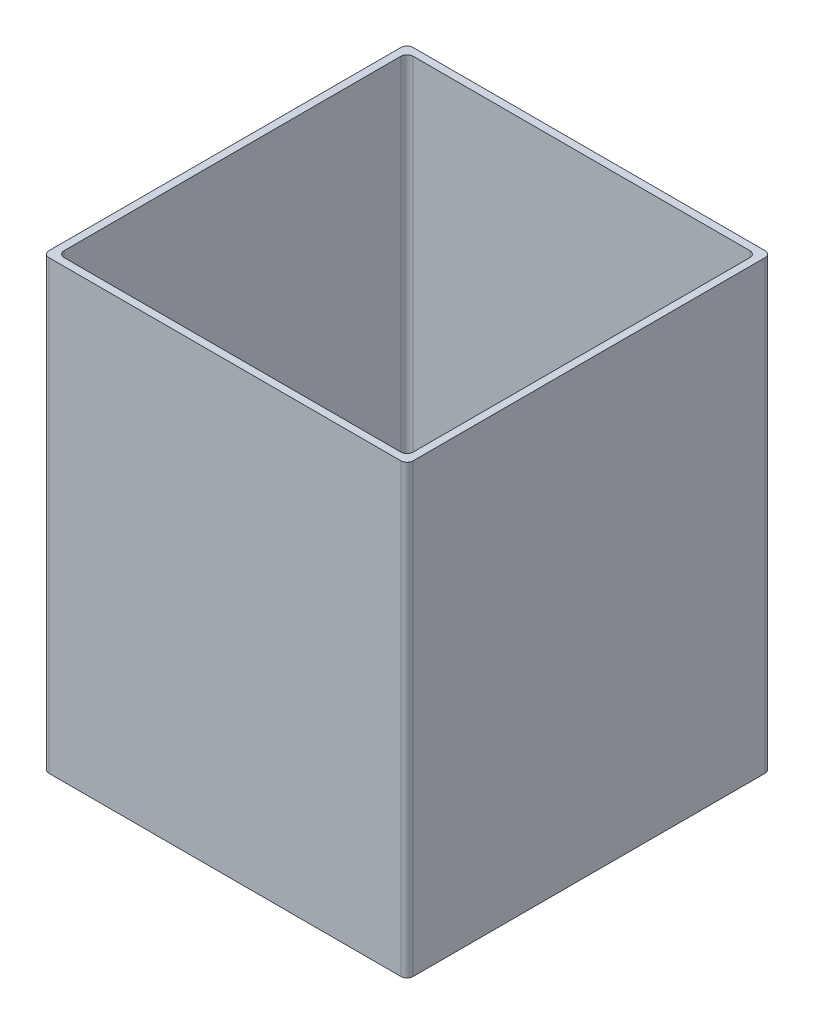
ISO-10303-21;
HEADER;
FILE_DESCRIPTION(('STEP AP214'),'2;1');
FILE_NAME('part.step','',(''),(''),'','','');
FILE_SCHEMA(('AUTOMOTIVE_DESIGN { 1 0 10303 214 1 1 1 1 }'));
ENDSEC;
DATA;
#1=APPLICATION_CONTEXT('core data for automotive mechanical design processes');
#2=APPLICATION_PROTOCOL_DEFINITION('international standard','automotive_design',2000,#1);
#3=PRODUCT_CONTEXT('',#1,'mechanical');
#4=PRODUCT('Part','Part','',(#3));
#5=PRODUCT_RELATED_PRODUCT_CATEGORY('part','',(#4));
#6=PRODUCT_DEFINITION_FORMATION('','',#4);
#7=PRODUCT_DEFINITION_CONTEXT('part definition',#1,'design');
#8=PRODUCT_DEFINITION('design','',#6,#7);
#9=PRODUCT_DEFINITION_SHAPE('','',#8);
#10=(LENGTH_UNIT() NAMED_UNIT(*) SI_UNIT(.MILLI.,.METRE.));
#11=(NAMED_UNIT(*) PLANE_ANGLE_UNIT() SI_UNIT($,.RADIAN.));
#12=(NAMED_UNIT(*) SI_UNIT($,.STERADIAN.) SOLID_ANGLE_UNIT());
#13=UNCERTAINTY_MEASURE_WITH_UNIT(LENGTH_MEASURE(1.E-05),#10,'distance_accuracy_value','');
#14=(GEOMETRIC_REPRESENTATION_CONTEXT(3) GLOBAL_UNCERTAINTY_ASSIGNED_CONTEXT((#13)) GLOBAL_UNIT_ASSIGNED_CONTEXT((#10,
#11,#12)) REPRESENTATION_CONTEXT('',''));
#15=CARTESIAN_POINT('',(0.,0.,0.));
#16=DIRECTION('',(0.,0.,1.));
#17=DIRECTION('',(1.,0.,0.));
#18=AXIS2_PLACEMENT_3D('',#15,#16,#17);
#19=CARTESIAN_POINT('',(60.,147.2,-60.));
#20=DIRECTION('',(-1.,0.,0.));
#21=DIRECTION('',(0.,0.,1.));
#22=AXIS2_PLACEMENT_3D('',#19,#20,#21);
#23=PLANE('',#22);
#24=DIRECTION('',(0.,0.,-1.));
#25=VECTOR('',#24,1.);
#26=CARTESIAN_POINT('',(60.,147.2,-60.));
#27=LINE('',#26,#25);
#28=CARTESIAN_POINT('',(60.,147.2,58.));
#29=VERTEX_POINT('',#28);
#30=CARTESIAN_POINT('',(60.,147.2,-58.));
#31=VERTEX_POINT('',#30);
#32=EDGE_CURVE('E169',#29,#31,#27,.T.);
#33=ORIENTED_EDGE('',*,*,#32,.F.);
#34=DIRECTION('',(0.,-1.,0.));
#35=VECTOR('',#34,1.);
#36=CARTESIAN_POINT('',(60.,147.2,58.));
#37=LINE('',#36,#35);
#38=CARTESIAN_POINT('',(60.,0.,58.));
#39=VERTEX_POINT('',#38);
#40=EDGE_CURVE('E154',#29,#39,#37,.T.);
#41=ORIENTED_EDGE('',*,*,#40,.T.);
#42=DIRECTION('',(0.,0.,-1.));
#43=VECTOR('',#42,1.);
#44=CARTESIAN_POINT('',(60.,0.,-60.));
#45=LINE('',#44,#43);
#46=CARTESIAN_POINT('',(60.,0.,-58.));
#47=VERTEX_POINT('',#46);
#48=EDGE_CURVE('E166',#39,#47,#45,.T.);
#49=ORIENTED_EDGE('',*,*,#48,.T.);
#50=DIRECTION('',(0.,-1.,0.));
#51=VECTOR('',#50,1.);
#52=CARTESIAN_POINT('',(60.,147.2,-58.));
#53=LINE('',#52,#51);
#54=EDGE_CURVE('E171',#47,#31,#53,.F.);
#55=ORIENTED_EDGE('',*,*,#54,.T.);
#56=EDGE_LOOP('',(#33,#41,#49,#55));
#57=FACE_BOUND('',#56,.T.);
#58=ADVANCED_FACE('F37',(#57),#23,.F.);
#59=CARTESIAN_POINT('',(-60.,147.2,-60.));
#60=DIRECTION('',(0.,0.,1.));
#61=DIRECTION('',(1.,0.,0.));
#62=AXIS2_PLACEMENT_3D('',#59,#60,#61);
#63=PLANE('',#62);
#64=DIRECTION('',(-1.,0.,0.));
#65=VECTOR('',#64,1.);
#66=CARTESIAN_POINT('',(-60.,147.2,-60.));
#67=LINE('',#66,#65);
#68=CARTESIAN_POINT('',(58.,147.2,-60.));
#69=VERTEX_POINT('',#68);
#70=CARTESIAN_POINT('',(-58.,147.2,-60.));
#71=VERTEX_POINT('',#70);
#72=EDGE_CURVE('E281',#69,#71,#67,.T.);
#73=ORIENTED_EDGE('',*,*,#72,.F.);
#74=DIRECTION('',(0.,-1.,0.));
#75=VECTOR('',#74,1.);
#76=CARTESIAN_POINT('',(58.,147.2,-60.));
#77=LINE('',#76,#75);
#78=CARTESIAN_POINT('',(58.,0.,-60.));
#79=VERTEX_POINT('',#78);
#80=EDGE_CURVE('E210',#69,#79,#77,.T.);
#81=ORIENTED_EDGE('',*,*,#80,.T.);
#82=DIRECTION('',(-1.,0.,0.));
#83=VECTOR('',#82,1.);
#84=CARTESIAN_POINT('',(-60.,0.,-60.));
#85=LINE('',#84,#83);
#86=CARTESIAN_POINT('',(-58.,0.,-60.));
#87=VERTEX_POINT('',#86);
#88=EDGE_CURVE('E175',#79,#87,#85,.T.);
#89=ORIENTED_EDGE('',*,*,#88,.T.);
#90=DIRECTION('',(0.,-1.,0.));
#91=VECTOR('',#90,1.);
#92=CARTESIAN_POINT('',(-58.,147.2,-60.));
#93=LINE('',#92,#91);
#94=EDGE_CURVE('E208',#87,#71,#93,.F.);
#95=ORIENTED_EDGE('',*,*,#94,.T.);
#96=EDGE_LOOP('',(#73,#81,#89,#95));
#97=FACE_BOUND('',#96,.T.);
#98=ADVANCED_FACE('F305',(#97),#63,.F.);
#99=CARTESIAN_POINT('',(-60.,147.2,-60.));
#100=DIRECTION('',(1.,0.,0.));
#101=DIRECTION('',(0.,0.,-1.));
#102=AXIS2_PLACEMENT_3D('',#99,#100,#101);
#103=PLANE('',#102);
#104=DIRECTION('',(0.,0.,1.));
#105=VECTOR('',#104,1.);
#106=CARTESIAN_POINT('',(-60.,0.,-60.));
#107=LINE('',#106,#105);
#108=CARTESIAN_POINT('',(-60.,0.,-58.));
#109=VERTEX_POINT('',#108);
#110=CARTESIAN_POINT('',(-60.,0.,58.));
#111=VERTEX_POINT('',#110);
#112=EDGE_CURVE('E179',#109,#111,#107,.T.);
#113=ORIENTED_EDGE('',*,*,#112,.T.);
#114=DIRECTION('',(0.,-1.,0.));
#115=VECTOR('',#114,1.);
#116=CARTESIAN_POINT('',(-60.,147.2,58.));
#117=LINE('',#116,#115);
#118=CARTESIAN_POINT('',(-60.,147.2,58.));
#119=VERTEX_POINT('',#118);
#120=EDGE_CURVE('E216',#111,#119,#117,.F.);
#121=ORIENTED_EDGE('',*,*,#120,.T.);
#122=DIRECTION('',(0.,0.,1.));
#123=VECTOR('',#122,1.);
#124=CARTESIAN_POINT('',(-60.,147.2,-60.));
#125=LINE('',#124,#123);
#126=CARTESIAN_POINT('',(-60.,147.2,-58.));
#127=VERTEX_POINT('',#126);
#128=EDGE_CURVE('E283',#127,#119,#125,.T.);
#129=ORIENTED_EDGE('',*,*,#128,.F.);
#130=DIRECTION('',(0.,-1.,0.));
#131=VECTOR('',#130,1.);
#132=CARTESIAN_POINT('',(-60.,147.2,-58.));
#133=LINE('',#132,#131);
#134=EDGE_CURVE('E213',#127,#109,#133,.T.);
#135=ORIENTED_EDGE('',*,*,#134,.T.);
#136=EDGE_LOOP('',(#113,#121,#129,#135));
#137=FACE_BOUND('',#136,.T.);
#138=ADVANCED_FACE('F297',(#137),#103,.F.);
#139=CARTESIAN_POINT('',(-60.,147.2,60.));
#140=DIRECTION('',(0.,0.,-1.));
#141=DIRECTION('',(-1.,0.,0.));
#142=AXIS2_PLACEMENT_3D('',#139,#140,#141);
#143=PLANE('',#142);
#144=DIRECTION('',(1.,0.,0.));
#145=VECTOR('',#144,1.);
#146=CARTESIAN_POINT('',(-60.,0.,60.));
#147=LINE('',#146,#145);
#148=CARTESIAN_POINT('',(-58.,0.,60.));
#149=VERTEX_POINT('',#148);
#150=CARTESIAN_POINT('',(58.,0.,60.));
#151=VERTEX_POINT('',#150);
#152=EDGE_CURVE('E190',#149,#151,#147,.T.);
#153=ORIENTED_EDGE('',*,*,#152,.T.);
#154=DIRECTION('',(0.,-1.,0.));
#155=VECTOR('',#154,1.);
#156=CARTESIAN_POINT('',(58.,147.2,60.));
#157=LINE('',#156,#155);
#158=CARTESIAN_POINT('',(58.,147.2,60.));
#159=VERTEX_POINT('',#158);
#160=EDGE_CURVE('E155',#151,#159,#157,.F.);
#161=ORIENTED_EDGE('',*,*,#160,.T.);
#162=DIRECTION('',(1.,0.,0.));
#163=VECTOR('',#162,1.);
#164=CARTESIAN_POINT('',(-60.,147.2,60.));
#165=LINE('',#164,#163);
#166=CARTESIAN_POINT('',(-58.,147.2,60.));
#167=VERTEX_POINT('',#166);
#168=EDGE_CURVE('E185',#167,#159,#165,.T.);
#169=ORIENTED_EDGE('',*,*,#168,.F.);
#170=DIRECTION('',(0.,-1.,0.));
#171=VECTOR('',#170,1.);
#172=CARTESIAN_POINT('',(-58.,147.2,60.));
#173=LINE('',#172,#171);
#174=EDGE_CURVE('E160',#167,#149,#173,.T.);
#175=ORIENTED_EDGE('',*,*,#174,.T.);
#176=EDGE_LOOP('',(#153,#161,#169,#175));
#177=FACE_BOUND('',#176,.T.);
#178=ADVANCED_FACE('F291',(#177),#143,.F.);
#179=CARTESIAN_POINT('',(0.,147.2,0.));
#180=DIRECTION('',(0.,1.,0.));
#181=DIRECTION('',(0.,0.,1.));
#182=AXIS2_PLACEMENT_3D('',#179,#180,#181);
#183=PLANE('',#182);
#184=DIRECTION('',(0.,0.,-1.));
#185=VECTOR('',#184,1.);
#186=CARTESIAN_POINT('',(57.5,147.2,0.));
#187=LINE('',#186,#185);
#188=CARTESIAN_POINT('',(57.5,147.2,55.5));
#189=VERTEX_POINT('',#188);
#190=CARTESIAN_POINT('',(57.5,147.2,-55.5));
#191=VERTEX_POINT('',#190);
#192=EDGE_CURVE('E176',#189,#191,#187,.T.);
#193=ORIENTED_EDGE('',*,*,#192,.F.);
#194=CARTESIAN_POINT('',(55.5,147.2,55.5));
#195=DIRECTION('',(0.,1.,0.));
#196=DIRECTION('',(0.,0.,1.));
#197=AXIS2_PLACEMENT_3D('',#194,#195,#196);
#198=CIRCLE('',#197,2.);
#199=CARTESIAN_POINT('',(55.5,147.2,57.5));
#200=VERTEX_POINT('',#199);
#201=EDGE_CURVE('E241',#189,#200,#198,.F.);
#202=ORIENTED_EDGE('',*,*,#201,.T.);
#203=DIRECTION('',(1.,0.,0.));
#204=VECTOR('',#203,1.);
#205=CARTESIAN_POINT('',(0.,147.2,57.5));
#206=LINE('',#205,#204);
#207=CARTESIAN_POINT('',(-55.5,147.2,57.5));
#208=VERTEX_POINT('',#207);
#209=EDGE_CURVE('E182',#208,#200,#206,.T.);
#210=ORIENTED_EDGE('',*,*,#209,.F.);
#211=CARTESIAN_POINT('',(-55.5,147.2,55.5));
#212=DIRECTION('',(0.,1.,0.));
#213=DIRECTION('',(0.,0.,1.));
#214=AXIS2_PLACEMENT_3D('',#211,#212,#213);
#215=CIRCLE('',#214,2.);
#216=CARTESIAN_POINT('',(-57.5,147.2,55.5));
#217=VERTEX_POINT('',#216);
#218=EDGE_CURVE('E245',#208,#217,#215,.F.);
#219=ORIENTED_EDGE('',*,*,#218,.T.);
#220=DIRECTION('',(0.,0.,1.));
#221=VECTOR('',#220,1.);
#222=CARTESIAN_POINT('',(-57.5,147.2,0.));
#223=LINE('',#222,#221);
#224=CARTESIAN_POINT('',(-57.5,147.2,-55.5));
#225=VERTEX_POINT('',#224);
#226=EDGE_CURVE('E256',#225,#217,#223,.T.);
#227=ORIENTED_EDGE('',*,*,#226,.F.);
#228=CARTESIAN_POINT('',(-55.5,147.2,-55.5));
#229=DIRECTION('',(0.,1.,0.));
#230=DIRECTION('',(0.,0.,1.));
#231=AXIS2_PLACEMENT_3D('',#228,#229,#230);
#232=CIRCLE('',#231,2.);
#233=CARTESIAN_POINT('',(-55.5,147.2,-57.5));
#234=VERTEX_POINT('',#233);
#235=EDGE_CURVE('E45',#225,#234,#232,.F.);
#236=ORIENTED_EDGE('',*,*,#235,.T.);
#237=DIRECTION('',(-1.,0.,0.));
#238=VECTOR('',#237,1.);
#239=CARTESIAN_POINT('',(0.,147.2,-57.5));
#240=LINE('',#239,#238);
#241=CARTESIAN_POINT('',(55.5,147.2,-57.5));
#242=VERTEX_POINT('',#241);
#243=EDGE_CURVE('E255',#242,#234,#240,.T.);
#244=ORIENTED_EDGE('',*,*,#243,.F.);
#245=CARTESIAN_POINT('',(55.5,147.2,-55.5));
#246=DIRECTION('',(0.,1.,0.));
#247=DIRECTION('',(0.,0.,1.));
#248=AXIS2_PLACEMENT_3D('',#245,#246,#247);
#249=CIRCLE('',#248,2.);
#250=EDGE_CURVE('E237',#242,#191,#249,.F.);
#251=ORIENTED_EDGE('',*,*,#250,.T.);
#252=EDGE_LOOP('',(#193,#202,#210,#219,#227,#236,#244,#251));
#253=FACE_BOUND('',#252,.T.);
#254=ORIENTED_EDGE('',*,*,#168,.T.);
#255=CARTESIAN_POINT('',(58.,147.2,58.));
#256=DIRECTION('',(0.,1.,0.));
#257=DIRECTION('',(0.,0.,1.));
#258=AXIS2_PLACEMENT_3D('',#255,#256,#257);
#259=CIRCLE('',#258,2.);
#260=EDGE_CURVE('E206',#159,#29,#259,.T.);
#261=ORIENTED_EDGE('',*,*,#260,.T.);
#262=ORIENTED_EDGE('',*,*,#32,.T.);
#263=CARTESIAN_POINT('',(58.,147.2,-58.));
#264=DIRECTION('',(0.,1.,0.));
#265=DIRECTION('',(0.,0.,1.));
#266=AXIS2_PLACEMENT_3D('',#263,#264,#265);
#267=CIRCLE('',#266,2.);
#268=EDGE_CURVE('E204',#31,#69,#267,.T.);
#269=ORIENTED_EDGE('',*,*,#268,.T.);
#270=ORIENTED_EDGE('',*,*,#72,.T.);
#271=CARTESIAN_POINT('',(-58.,147.2,-58.));
#272=DIRECTION('',(0.,1.,0.));
#273=DIRECTION('',(0.,0.,1.));
#274=AXIS2_PLACEMENT_3D('',#271,#272,#273);
#275=CIRCLE('',#274,2.);
#276=EDGE_CURVE('E200',#71,#127,#275,.T.);
#277=ORIENTED_EDGE('',*,*,#276,.T.);
#278=ORIENTED_EDGE('',*,*,#128,.T.);
#279=CARTESIAN_POINT('',(-58.,147.2,58.));
#280=DIRECTION('',(0.,1.,0.));
#281=DIRECTION('',(0.,0.,1.));
#282=AXIS2_PLACEMENT_3D('',#279,#280,#281);
#283=CIRCLE('',#282,2.);
#284=EDGE_CURVE('E202',#119,#167,#283,.T.);
#285=ORIENTED_EDGE('',*,*,#284,.T.);
#286=EDGE_LOOP('',(#254,#261,#262,#269,#270,#277,#278,#285));
#287=FACE_BOUND('',#286,.T.);
#288=ADVANCED_FACE('F253',(#253,#287),#183,.T.);
#289=CARTESIAN_POINT('',(0.,0.,0.));
#290=DIRECTION('',(0.,1.,0.));
#291=DIRECTION('',(0.,0.,1.));
#292=AXIS2_PLACEMENT_3D('',#289,#290,#291);
#293=PLANE('',#292);
#294=DIRECTION('',(0.,0.,1.));
#295=VECTOR('',#294,1.);
#296=CARTESIAN_POINT('',(-57.5,0.,-57.5));
#297=LINE('',#296,#295);
#298=CARTESIAN_POINT('',(-57.5,0.,-55.5));
#299=VERTEX_POINT('',#298);
#300=CARTESIAN_POINT('',(-57.5,0.,55.5));
#301=VERTEX_POINT('',#300);
#302=EDGE_CURVE('E267',#299,#301,#297,.T.);
#303=ORIENTED_EDGE('',*,*,#302,.T.);
#304=CARTESIAN_POINT('',(-55.5,0.,55.5));
#305=DIRECTION('',(0.,1.,0.));
#306=DIRECTION('',(0.,0.,1.));
#307=AXIS2_PLACEMENT_3D('',#304,#305,#306);
#308=CIRCLE('',#307,2.);
#309=CARTESIAN_POINT('',(-55.5,0.,57.5));
#310=VERTEX_POINT('',#309);
#311=EDGE_CURVE('E247',#301,#310,#308,.T.);
#312=ORIENTED_EDGE('',*,*,#311,.T.);
#313=DIRECTION('',(1.,0.,0.));
#314=VECTOR('',#313,1.);
#315=CARTESIAN_POINT('',(-57.5,0.,57.5));
#316=LINE('',#315,#314);
#317=CARTESIAN_POINT('',(55.5,0.,57.5));
#318=VERTEX_POINT('',#317);
#319=EDGE_CURVE('E264',#310,#318,#316,.T.);
#320=ORIENTED_EDGE('',*,*,#319,.T.);
#321=CARTESIAN_POINT('',(55.5,0.,55.5));
#322=DIRECTION('',(0.,1.,0.));
#323=DIRECTION('',(0.,0.,1.));
#324=AXIS2_PLACEMENT_3D('',#321,#322,#323);
#325=CIRCLE('',#324,2.);
#326=CARTESIAN_POINT('',(57.5,0.,55.5));
#327=VERTEX_POINT('',#326);
#328=EDGE_CURVE('E243',#318,#327,#325,.T.);
#329=ORIENTED_EDGE('',*,*,#328,.T.);
#330=DIRECTION('',(0.,0.,-1.));
#331=VECTOR('',#330,1.);
#332=CARTESIAN_POINT('',(57.5,0.,-57.5));
#333=LINE('',#332,#331);
#334=CARTESIAN_POINT('',(57.5,0.,-55.5));
#335=VERTEX_POINT('',#334);
#336=EDGE_CURVE('E273',#327,#335,#333,.T.);
#337=ORIENTED_EDGE('',*,*,#336,.T.);
#338=CARTESIAN_POINT('',(55.5,0.,-55.5));
#339=DIRECTION('',(0.,1.,0.));
#340=DIRECTION('',(0.,0.,1.));
#341=AXIS2_PLACEMENT_3D('',#338,#339,#340);
#342=CIRCLE('',#341,2.);
#343=CARTESIAN_POINT('',(55.5,0.,-57.5));
#344=VERTEX_POINT('',#343);
#345=EDGE_CURVE('E239',#335,#344,#342,.T.);
#346=ORIENTED_EDGE('',*,*,#345,.T.);
#347=DIRECTION('',(-1.,0.,0.));
#348=VECTOR('',#347,1.);
#349=CARTESIAN_POINT('',(-57.5,0.,-57.5));
#350=LINE('',#349,#348);
#351=CARTESIAN_POINT('',(-55.5,0.,-57.5));
#352=VERTEX_POINT('',#351);
#353=EDGE_CURVE('E269',#344,#352,#350,.T.);
#354=ORIENTED_EDGE('',*,*,#353,.T.);
#355=CARTESIAN_POINT('',(-55.5,0.,-55.5));
#356=DIRECTION('',(0.,1.,0.));
#357=DIRECTION('',(0.,0.,1.));
#358=AXIS2_PLACEMENT_3D('',#355,#356,#357);
#359=CIRCLE('',#358,2.);
#360=EDGE_CURVE('E11',#352,#299,#359,.T.);
#361=ORIENTED_EDGE('',*,*,#360,.T.);
#362=EDGE_LOOP('',(#303,#312,#320,#329,#337,#346,#354,#361));
#363=FACE_BOUND('',#362,.T.);
#364=ORIENTED_EDGE('',*,*,#48,.F.);
#365=CARTESIAN_POINT('',(58.,0.,58.));
#366=DIRECTION('',(0.,1.,0.));
#367=DIRECTION('',(0.,0.,1.));
#368=AXIS2_PLACEMENT_3D('',#365,#366,#367);
#369=CIRCLE('',#368,2.);
#370=EDGE_CURVE('E150',#39,#151,#369,.F.);
#371=ORIENTED_EDGE('',*,*,#370,.T.);
#372=ORIENTED_EDGE('',*,*,#152,.F.);
#373=CARTESIAN_POINT('',(-58.,0.,58.));
#374=DIRECTION('',(0.,1.,0.));
#375=DIRECTION('',(0.,0.,1.));
#376=AXIS2_PLACEMENT_3D('',#373,#374,#375);
#377=CIRCLE('',#376,2.);
#378=EDGE_CURVE('E194',#149,#111,#377,.F.);
#379=ORIENTED_EDGE('',*,*,#378,.T.);
#380=ORIENTED_EDGE('',*,*,#112,.F.);
#381=CARTESIAN_POINT('',(-58.,0.,-58.));
#382=DIRECTION('',(0.,1.,0.));
#383=DIRECTION('',(0.,0.,1.));
#384=AXIS2_PLACEMENT_3D('',#381,#382,#383);
#385=CIRCLE('',#384,2.);
#386=EDGE_CURVE('E170',#109,#87,#385,.F.);
#387=ORIENTED_EDGE('',*,*,#386,.T.);
#388=ORIENTED_EDGE('',*,*,#88,.F.);
#389=CARTESIAN_POINT('',(58.,0.,-58.));
#390=DIRECTION('',(0.,1.,0.));
#391=DIRECTION('',(0.,0.,1.));
#392=AXIS2_PLACEMENT_3D('',#389,#390,#391);
#393=CIRCLE('',#392,2.);
#394=EDGE_CURVE('E161',#79,#47,#393,.F.);
#395=ORIENTED_EDGE('',*,*,#394,.T.);
#396=EDGE_LOOP('',(#364,#371,#372,#379,#380,#387,#388,#395));
#397=FACE_BOUND('',#396,.T.);
#398=ADVANCED_FACE('F173',(#363,#397),#293,.F.);
#399=CARTESIAN_POINT('',(57.5,0.,-57.5));
#400=DIRECTION('',(1.,0.,0.));
#401=DIRECTION('',(0.,0.,-1.));
#402=AXIS2_PLACEMENT_3D('',#399,#400,#401);
#403=PLANE('',#402);
#404=ORIENTED_EDGE('',*,*,#192,.T.);
#405=DIRECTION('',(0.,1.,0.));
#406=VECTOR('',#405,1.);
#407=CARTESIAN_POINT('',(57.5,0.,-55.5));
#408=LINE('',#407,#406);
#409=EDGE_CURVE('E226',#191,#335,#408,.F.);
#410=ORIENTED_EDGE('',*,*,#409,.T.);
#411=ORIENTED_EDGE('',*,*,#336,.F.);
#412=DIRECTION('',(0.,1.,0.));
#413=VECTOR('',#412,1.);
#414=CARTESIAN_POINT('',(57.5,147.2,55.5));
#415=LINE('',#414,#413);
#416=EDGE_CURVE('E223',#327,#189,#415,.T.);
#417=ORIENTED_EDGE('',*,*,#416,.T.);
#418=EDGE_LOOP('',(#404,#410,#411,#417));
#419=FACE_BOUND('',#418,.T.);
#420=ADVANCED_FACE('F331',(#419),#403,.F.);
#421=CARTESIAN_POINT('',(-57.5,0.,57.5));
#422=DIRECTION('',(0.,0.,1.));
#423=DIRECTION('',(1.,0.,0.));
#424=AXIS2_PLACEMENT_3D('',#421,#422,#423);
#425=PLANE('',#424);
#426=ORIENTED_EDGE('',*,*,#209,.T.);
#427=DIRECTION('',(0.,1.,0.));
#428=VECTOR('',#427,1.);
#429=CARTESIAN_POINT('',(55.5,0.,57.5));
#430=LINE('',#429,#428);
#431=EDGE_CURVE('E231',#200,#318,#430,.F.);
#432=ORIENTED_EDGE('',*,*,#431,.T.);
#433=ORIENTED_EDGE('',*,*,#319,.F.);
#434=DIRECTION('',(0.,1.,0.));
#435=VECTOR('',#434,1.);
#436=CARTESIAN_POINT('',(-55.5,147.2,57.5));
#437=LINE('',#436,#435);
#438=EDGE_CURVE('E228',#310,#208,#437,.T.);
#439=ORIENTED_EDGE('',*,*,#438,.T.);
#440=EDGE_LOOP('',(#426,#432,#433,#439));
#441=FACE_BOUND('',#440,.T.);
#442=ADVANCED_FACE('F336',(#441),#425,.F.);
#443=CARTESIAN_POINT('',(-57.5,0.,-57.5));
#444=DIRECTION('',(-1.,0.,0.));
#445=DIRECTION('',(0.,0.,1.));
#446=AXIS2_PLACEMENT_3D('',#443,#444,#445);
#447=PLANE('',#446);
#448=ORIENTED_EDGE('',*,*,#226,.T.);
#449=DIRECTION('',(0.,1.,0.));
#450=VECTOR('',#449,1.);
#451=CARTESIAN_POINT('',(-57.5,0.,55.5));
#452=LINE('',#451,#450);
#453=EDGE_CURVE('E52',#217,#301,#452,.F.);
#454=ORIENTED_EDGE('',*,*,#453,.T.);
#455=ORIENTED_EDGE('',*,*,#302,.F.);
#456=DIRECTION('',(0.,1.,0.));
#457=VECTOR('',#456,1.);
#458=CARTESIAN_POINT('',(-57.5,147.2,-55.5));
#459=LINE('',#458,#457);
#460=EDGE_CURVE('E233',#299,#225,#459,.T.);
#461=ORIENTED_EDGE('',*,*,#460,.T.);
#462=EDGE_LOOP('',(#448,#454,#455,#461));
#463=FACE_BOUND('',#462,.T.);
#464=ADVANCED_FACE('F266',(#463),#447,.F.);
#465=CARTESIAN_POINT('',(-57.5,0.,-57.5));
#466=DIRECTION('',(0.,0.,-1.));
#467=DIRECTION('',(-1.,0.,0.));
#468=AXIS2_PLACEMENT_3D('',#465,#466,#467);
#469=PLANE('',#468);
#470=ORIENTED_EDGE('',*,*,#353,.F.);
#471=DIRECTION('',(0.,1.,0.));
#472=VECTOR('',#471,1.);
#473=CARTESIAN_POINT('',(55.5,147.2,-57.5));
#474=LINE('',#473,#472);
#475=EDGE_CURVE('E220',#344,#242,#474,.T.);
#476=ORIENTED_EDGE('',*,*,#475,.T.);
#477=ORIENTED_EDGE('',*,*,#243,.T.);
#478=DIRECTION('',(0.,1.,0.));
#479=VECTOR('',#478,1.);
#480=CARTESIAN_POINT('',(-55.5,0.,-57.5));
#481=LINE('',#480,#479);
#482=EDGE_CURVE('E218',#234,#352,#481,.F.);
#483=ORIENTED_EDGE('',*,*,#482,.T.);
#484=EDGE_LOOP('',(#470,#476,#477,#483));
#485=FACE_BOUND('',#484,.T.);
#486=ADVANCED_FACE('F262',(#485),#469,.F.);
#487=CARTESIAN_POINT('',(58.,147.2,58.));
#488=DIRECTION('',(0.,-1.,0.));
#489=DIRECTION('',(0.,0.,-1.));
#490=AXIS2_PLACEMENT_3D('',#487,#488,#489);
#491=CYLINDRICAL_SURFACE('',#490,2.);
#492=ORIENTED_EDGE('',*,*,#260,.F.);
#493=ORIENTED_EDGE('',*,*,#160,.F.);
#494=ORIENTED_EDGE('',*,*,#370,.F.);
#495=ORIENTED_EDGE('',*,*,#40,.F.);
#496=EDGE_LOOP('',(#492,#493,#494,#495));
#497=FACE_BOUND('',#496,.T.);
#498=ADVANCED_FACE('F153',(#497),#491,.T.);
#499=CARTESIAN_POINT('',(58.,147.2,-58.));
#500=DIRECTION('',(0.,-1.,0.));
#501=DIRECTION('',(0.,0.,-1.));
#502=AXIS2_PLACEMENT_3D('',#499,#500,#501);
#503=CYLINDRICAL_SURFACE('',#502,2.);
#504=ORIENTED_EDGE('',*,*,#268,.F.);
#505=ORIENTED_EDGE('',*,*,#54,.F.);
#506=ORIENTED_EDGE('',*,*,#394,.F.);
#507=ORIENTED_EDGE('',*,*,#80,.F.);
#508=EDGE_LOOP('',(#504,#505,#506,#507));
#509=FACE_BOUND('',#508,.T.);
#510=ADVANCED_FACE('F309',(#509),#503,.T.);
#511=CARTESIAN_POINT('',(-58.,147.2,58.));
#512=DIRECTION('',(0.,-1.,0.));
#513=DIRECTION('',(0.,0.,-1.));
#514=AXIS2_PLACEMENT_3D('',#511,#512,#513);
#515=CYLINDRICAL_SURFACE('',#514,2.);
#516=ORIENTED_EDGE('',*,*,#284,.F.);
#517=ORIENTED_EDGE('',*,*,#120,.F.);
#518=ORIENTED_EDGE('',*,*,#378,.F.);
#519=ORIENTED_EDGE('',*,*,#174,.F.);
#520=EDGE_LOOP('',(#516,#517,#518,#519));
#521=FACE_BOUND('',#520,.T.);
#522=ADVANCED_FACE('F293',(#521),#515,.T.);
#523=CARTESIAN_POINT('',(-58.,147.2,-58.));
#524=DIRECTION('',(0.,-1.,0.));
#525=DIRECTION('',(0.,0.,-1.));
#526=AXIS2_PLACEMENT_3D('',#523,#524,#525);
#527=CYLINDRICAL_SURFACE('',#526,2.);
#528=ORIENTED_EDGE('',*,*,#276,.F.);
#529=ORIENTED_EDGE('',*,*,#94,.F.);
#530=ORIENTED_EDGE('',*,*,#386,.F.);
#531=ORIENTED_EDGE('',*,*,#134,.F.);
#532=EDGE_LOOP('',(#528,#529,#530,#531));
#533=FACE_BOUND('',#532,.T.);
#534=ADVANCED_FACE('F301',(#533),#527,.T.);
#535=CARTESIAN_POINT('',(55.5,0.,-55.5));
#536=DIRECTION('',(0.,-1.,0.));
#537=DIRECTION('',(0.,0.,-1.));
#538=AXIS2_PLACEMENT_3D('',#535,#536,#537);
#539=CYLINDRICAL_SURFACE('',#538,2.);
#540=ORIENTED_EDGE('',*,*,#345,.F.);
#541=ORIENTED_EDGE('',*,*,#409,.F.);
#542=ORIENTED_EDGE('',*,*,#250,.F.);
#543=ORIENTED_EDGE('',*,*,#475,.F.);
#544=EDGE_LOOP('',(#540,#541,#542,#543));
#545=FACE_BOUND('',#544,.T.);
#546=ADVANCED_FACE('F359',(#545),#539,.F.);
#547=CARTESIAN_POINT('',(55.5,0.,55.5));
#548=DIRECTION('',(0.,-1.,0.));
#549=DIRECTION('',(0.,0.,-1.));
#550=AXIS2_PLACEMENT_3D('',#547,#548,#549);
#551=CYLINDRICAL_SURFACE('',#550,2.);
#552=ORIENTED_EDGE('',*,*,#328,.F.);
#553=ORIENTED_EDGE('',*,*,#431,.F.);
#554=ORIENTED_EDGE('',*,*,#201,.F.);
#555=ORIENTED_EDGE('',*,*,#416,.F.);
#556=EDGE_LOOP('',(#552,#553,#554,#555));
#557=FACE_BOUND('',#556,.T.);
#558=ADVANCED_FACE('F352',(#557),#551,.F.);
#559=CARTESIAN_POINT('',(-55.5,0.,55.5));
#560=DIRECTION('',(0.,-1.,0.));
#561=DIRECTION('',(0.,0.,-1.));
#562=AXIS2_PLACEMENT_3D('',#559,#560,#561);
#563=CYLINDRICAL_SURFACE('',#562,2.);
#564=ORIENTED_EDGE('',*,*,#311,.F.);
#565=ORIENTED_EDGE('',*,*,#453,.F.);
#566=ORIENTED_EDGE('',*,*,#218,.F.);
#567=ORIENTED_EDGE('',*,*,#438,.F.);
#568=EDGE_LOOP('',(#564,#565,#566,#567));
#569=FACE_BOUND('',#568,.T.);
#570=ADVANCED_FACE('F366',(#569),#563,.F.);
#571=CARTESIAN_POINT('',(-55.5,0.,-55.5));
#572=DIRECTION('',(0.,-1.,0.));
#573=DIRECTION('',(0.,0.,-1.));
#574=AXIS2_PLACEMENT_3D('',#571,#572,#573);
#575=CYLINDRICAL_SURFACE('',#574,2.);
#576=ORIENTED_EDGE('',*,*,#360,.F.);
#577=ORIENTED_EDGE('',*,*,#482,.F.);
#578=ORIENTED_EDGE('',*,*,#235,.F.);
#579=ORIENTED_EDGE('',*,*,#460,.F.);
#580=EDGE_LOOP('',(#576,#577,#578,#579));
#581=FACE_BOUND('',#580,.T.);
#582=ADVANCED_FACE('F39',(#581),#575,.F.);
#583=CLOSED_SHELL('',(#58,#98,#138,#178,#288,#398,#420,#442,#464,#486,#498,#510,#522,#534,#546,
#558,#570,#582));
#584=MANIFOLD_SOLID_BREP('B2',#583);
#585=ADVANCED_BREP_SHAPE_REPRESENTATION('',(#18,#584),#14);
#586=SHAPE_DEFINITION_REPRESENTATION(#9,#585);
ENDSEC;
END-ISO-10303-21;
